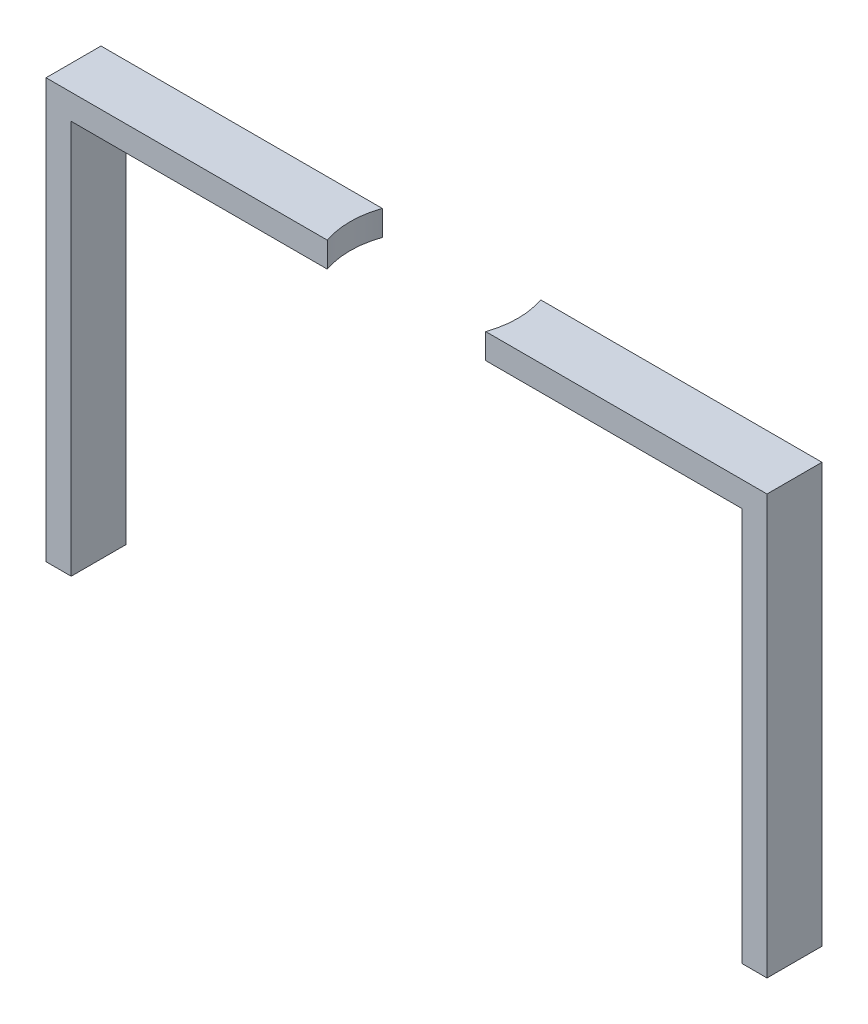
ISO-10303-21;
HEADER;
FILE_DESCRIPTION(('STEP AP214'),'2;1');
FILE_NAME('part.step','',(''),(''),'','','');
FILE_SCHEMA(('AUTOMOTIVE_DESIGN { 1 0 10303 214 1 1 1 1 }'));
ENDSEC;
DATA;
#1=APPLICATION_CONTEXT('core data for automotive mechanical design processes');
#2=APPLICATION_PROTOCOL_DEFINITION('international standard','automotive_design',2000,#1);
#3=PRODUCT_CONTEXT('',#1,'mechanical');
#4=PRODUCT('Part','Part','',(#3));
#5=PRODUCT_RELATED_PRODUCT_CATEGORY('part','',(#4));
#6=PRODUCT_DEFINITION_FORMATION('','',#4);
#7=PRODUCT_DEFINITION_CONTEXT('part definition',#1,'design');
#8=PRODUCT_DEFINITION('design','',#6,#7);
#9=PRODUCT_DEFINITION_SHAPE('','',#8);
#10=(LENGTH_UNIT() NAMED_UNIT(*) SI_UNIT(.MILLI.,.METRE.));
#11=(NAMED_UNIT(*) PLANE_ANGLE_UNIT() SI_UNIT($,.RADIAN.));
#12=(NAMED_UNIT(*) SI_UNIT($,.STERADIAN.) SOLID_ANGLE_UNIT());
#13=UNCERTAINTY_MEASURE_WITH_UNIT(LENGTH_MEASURE(1.E-05),#10,'distance_accuracy_value','');
#14=(GEOMETRIC_REPRESENTATION_CONTEXT(3) GLOBAL_UNCERTAINTY_ASSIGNED_CONTEXT((#13)) GLOBAL_UNIT_ASSIGNED_CONTEXT((#10,
#11,#12)) REPRESENTATION_CONTEXT('',''));
#15=CARTESIAN_POINT('',(0.,0.,0.));
#16=DIRECTION('',(0.,0.,1.));
#17=DIRECTION('',(1.,0.,0.));
#18=AXIS2_PLACEMENT_3D('',#15,#16,#17);
#19=CARTESIAN_POINT('',(-354.854368932039,121.072815533981,32.78));
#20=DIRECTION('',(0.,1.,0.));
#21=DIRECTION('',(0.,0.,1.));
#22=AXIS2_PLACEMENT_3D('',#19,#20,#21);
#23=PLANE('',#22);
#24=DIRECTION('',(1.,0.,0.));
#25=VECTOR('',#24,1.);
#26=CARTESIAN_POINT('',(-354.854368932039,121.072815533981,32.78));
#27=LINE('',#26,#25);
#28=CARTESIAN_POINT('',(-107.617011893356,121.072815533981,32.78));
#29=VERTEX_POINT('',#28);
#30=CARTESIAN_POINT('',(45.1456310679612,121.072815533981,32.78));
#31=VERTEX_POINT('',#30);
#32=EDGE_CURVE('E126',#29,#31,#27,.T.);
#33=ORIENTED_EDGE('',*,*,#32,.F.);
#34=CARTESIAN_POINT('',(-154.854368932039,121.072815533981,16.39));
#35=DIRECTION('',(0.,1.,0.));
#36=DIRECTION('',(-1.,0.,0.));
#37=AXIS2_PLACEMENT_3D('',#34,#35,#36);
#38=CIRCLE('',#37,50.);
#39=CARTESIAN_POINT('',(-107.617011893356,121.072815533981,0.));
#40=VERTEX_POINT('',#39);
#41=EDGE_CURVE('E66',#29,#40,#38,.T.);
#42=ORIENTED_EDGE('',*,*,#41,.T.);
#43=DIRECTION('',(1.,0.,0.));
#44=VECTOR('',#43,1.);
#45=CARTESIAN_POINT('',(-354.854368932039,121.072815533981,0.));
#46=LINE('',#45,#44);
#47=CARTESIAN_POINT('',(45.1456310679612,121.072815533981,0.));
#48=VERTEX_POINT('',#47);
#49=EDGE_CURVE('E130',#40,#48,#46,.T.);
#50=ORIENTED_EDGE('',*,*,#49,.T.);
#51=DIRECTION('',(0.,0.,-1.));
#52=VECTOR('',#51,1.);
#53=CARTESIAN_POINT('',(45.1456310679612,121.072815533981,32.78));
#54=LINE('',#53,#52);
#55=EDGE_CURVE('E150',#31,#48,#54,.T.);
#56=ORIENTED_EDGE('',*,*,#55,.F.);
#57=EDGE_LOOP('',(#33,#42,#50,#56));
#58=FACE_BOUND('',#57,.T.);
#59=ADVANCED_FACE('F49',(#58),#23,.F.);
#60=CARTESIAN_POINT('',(0.,0.,32.78));
#61=DIRECTION('',(0.,0.,1.));
#62=DIRECTION('',(1.,0.,0.));
#63=AXIS2_PLACEMENT_3D('',#60,#61,#62);
#64=PLANE('',#63);
#65=DIRECTION('',(0.,1.,0.));
#66=VECTOR('',#65,1.);
#67=CARTESIAN_POINT('',(-107.617011893356,121.072815533981,32.78));
#68=LINE('',#67,#66);
#69=CARTESIAN_POINT('',(-107.617011893356,136.072815533981,32.78));
#70=VERTEX_POINT('',#69);
#71=EDGE_CURVE('E59',#29,#70,#68,.T.);
#72=ORIENTED_EDGE('',*,*,#71,.F.);
#73=ORIENTED_EDGE('',*,*,#32,.T.);
#74=DIRECTION('',(0.,-1.,0.));
#75=VECTOR('',#74,1.);
#76=CARTESIAN_POINT('',(45.1456310679612,121.072815533981,32.78));
#77=LINE('',#76,#75);
#78=CARTESIAN_POINT('',(45.1456310679612,-113.927184466019,32.78));
#79=VERTEX_POINT('',#78);
#80=EDGE_CURVE('E129',#31,#79,#77,.T.);
#81=ORIENTED_EDGE('',*,*,#80,.T.);
#82=DIRECTION('',(1.,0.,0.));
#83=VECTOR('',#82,1.);
#84=CARTESIAN_POINT('',(45.1456310679612,-113.927184466019,32.78));
#85=LINE('',#84,#83);
#86=CARTESIAN_POINT('',(60.1456310679612,-113.927184466019,32.78));
#87=VERTEX_POINT('',#86);
#88=EDGE_CURVE('E122',#79,#87,#85,.T.);
#89=ORIENTED_EDGE('',*,*,#88,.T.);
#90=DIRECTION('',(0.,1.,0.));
#91=VECTOR('',#90,1.);
#92=CARTESIAN_POINT('',(60.1456310679612,-113.927184466019,32.78));
#93=LINE('',#92,#91);
#94=CARTESIAN_POINT('',(60.1456310679612,136.072815533981,32.78));
#95=VERTEX_POINT('',#94);
#96=EDGE_CURVE('E113',#87,#95,#93,.T.);
#97=ORIENTED_EDGE('',*,*,#96,.T.);
#98=DIRECTION('',(-1.,0.,0.));
#99=VECTOR('',#98,1.);
#100=CARTESIAN_POINT('',(60.1456310679612,136.072815533981,32.78));
#101=LINE('',#100,#99);
#102=EDGE_CURVE('E108',#95,#70,#101,.T.);
#103=ORIENTED_EDGE('',*,*,#102,.T.);
#104=EDGE_LOOP('',(#72,#73,#81,#89,#97,#103));
#105=FACE_BOUND('',#104,.T.);
#106=ADVANCED_FACE('F111',(#105),#64,.T.);
#107=CARTESIAN_POINT('',(0.,0.,0.));
#108=DIRECTION('',(0.,0.,1.));
#109=DIRECTION('',(1.,0.,0.));
#110=AXIS2_PLACEMENT_3D('',#107,#108,#109);
#111=PLANE('',#110);
#112=ORIENTED_EDGE('',*,*,#49,.F.);
#113=DIRECTION('',(0.,1.,0.));
#114=VECTOR('',#113,1.);
#115=CARTESIAN_POINT('',(-107.617011893356,121.072815533981,0.));
#116=LINE('',#115,#114);
#117=CARTESIAN_POINT('',(-107.617011893356,136.072815533981,0.));
#118=VERTEX_POINT('',#117);
#119=EDGE_CURVE('E116',#40,#118,#116,.T.);
#120=ORIENTED_EDGE('',*,*,#119,.T.);
#121=DIRECTION('',(-1.,0.,0.));
#122=VECTOR('',#121,1.);
#123=CARTESIAN_POINT('',(60.1456310679612,136.072815533981,0.));
#124=LINE('',#123,#122);
#125=CARTESIAN_POINT('',(60.1456310679612,136.072815533981,0.));
#126=VERTEX_POINT('',#125);
#127=EDGE_CURVE('E110',#126,#118,#124,.T.);
#128=ORIENTED_EDGE('',*,*,#127,.F.);
#129=DIRECTION('',(0.,1.,0.));
#130=VECTOR('',#129,1.);
#131=CARTESIAN_POINT('',(60.1456310679612,-113.927184466019,0.));
#132=LINE('',#131,#130);
#133=CARTESIAN_POINT('',(60.1456310679612,-113.927184466019,0.));
#134=VERTEX_POINT('',#133);
#135=EDGE_CURVE('E166',#134,#126,#132,.T.);
#136=ORIENTED_EDGE('',*,*,#135,.F.);
#137=DIRECTION('',(1.,0.,0.));
#138=VECTOR('',#137,1.);
#139=CARTESIAN_POINT('',(45.1456310679612,-113.927184466019,0.));
#140=LINE('',#139,#138);
#141=CARTESIAN_POINT('',(45.1456310679612,-113.927184466019,0.));
#142=VERTEX_POINT('',#141);
#143=EDGE_CURVE('E145',#142,#134,#140,.T.);
#144=ORIENTED_EDGE('',*,*,#143,.F.);
#145=DIRECTION('',(0.,-1.,0.));
#146=VECTOR('',#145,1.);
#147=CARTESIAN_POINT('',(45.1456310679612,121.072815533981,0.));
#148=LINE('',#147,#146);
#149=EDGE_CURVE('E120',#48,#142,#148,.T.);
#150=ORIENTED_EDGE('',*,*,#149,.F.);
#151=EDGE_LOOP('',(#112,#120,#128,#136,#144,#150));
#152=FACE_BOUND('',#151,.T.);
#153=ADVANCED_FACE('F142',(#152),#111,.F.);
#154=CARTESIAN_POINT('',(45.1456310679612,121.072815533981,32.78));
#155=DIRECTION('',(1.,0.,0.));
#156=DIRECTION('',(0.,1.,0.));
#157=AXIS2_PLACEMENT_3D('',#154,#155,#156);
#158=PLANE('',#157);
#159=ORIENTED_EDGE('',*,*,#149,.T.);
#160=DIRECTION('',(0.,0.,-1.));
#161=VECTOR('',#160,1.);
#162=CARTESIAN_POINT('',(45.1456310679612,-113.927184466019,32.78));
#163=LINE('',#162,#161);
#164=EDGE_CURVE('E162',#79,#142,#163,.T.);
#165=ORIENTED_EDGE('',*,*,#164,.F.);
#166=ORIENTED_EDGE('',*,*,#80,.F.);
#167=ORIENTED_EDGE('',*,*,#55,.T.);
#168=EDGE_LOOP('',(#159,#165,#166,#167));
#169=FACE_BOUND('',#168,.T.);
#170=ADVANCED_FACE('F163',(#169),#158,.F.);
#171=CARTESIAN_POINT('',(45.1456310679612,-113.927184466019,32.78));
#172=DIRECTION('',(0.,1.,0.));
#173=DIRECTION('',(0.,0.,1.));
#174=AXIS2_PLACEMENT_3D('',#171,#172,#173);
#175=PLANE('',#174);
#176=ORIENTED_EDGE('',*,*,#143,.T.);
#177=DIRECTION('',(0.,0.,-1.));
#178=VECTOR('',#177,1.);
#179=CARTESIAN_POINT('',(60.1456310679612,-113.927184466019,32.78));
#180=LINE('',#179,#178);
#181=EDGE_CURVE('E133',#87,#134,#180,.T.);
#182=ORIENTED_EDGE('',*,*,#181,.F.);
#183=ORIENTED_EDGE('',*,*,#88,.F.);
#184=ORIENTED_EDGE('',*,*,#164,.T.);
#185=EDGE_LOOP('',(#176,#182,#183,#184));
#186=FACE_BOUND('',#185,.T.);
#187=ADVANCED_FACE('F168',(#186),#175,.F.);
#188=CARTESIAN_POINT('',(60.1456310679612,-113.927184466019,32.78));
#189=DIRECTION('',(-1.,0.,0.));
#190=DIRECTION('',(0.,-1.,0.));
#191=AXIS2_PLACEMENT_3D('',#188,#189,#190);
#192=PLANE('',#191);
#193=ORIENTED_EDGE('',*,*,#135,.T.);
#194=DIRECTION('',(0.,0.,-1.));
#195=VECTOR('',#194,1.);
#196=CARTESIAN_POINT('',(60.1456310679612,136.072815533981,32.78));
#197=LINE('',#196,#195);
#198=EDGE_CURVE('E101',#95,#126,#197,.T.);
#199=ORIENTED_EDGE('',*,*,#198,.F.);
#200=ORIENTED_EDGE('',*,*,#96,.F.);
#201=ORIENTED_EDGE('',*,*,#181,.T.);
#202=EDGE_LOOP('',(#193,#199,#200,#201));
#203=FACE_BOUND('',#202,.T.);
#204=ADVANCED_FACE('F173',(#203),#192,.F.);
#205=CARTESIAN_POINT('',(60.1456310679612,136.072815533981,32.78));
#206=DIRECTION('',(0.,-1.,0.));
#207=DIRECTION('',(1.,0.,0.));
#208=AXIS2_PLACEMENT_3D('',#205,#206,#207);
#209=PLANE('',#208);
#210=ORIENTED_EDGE('',*,*,#127,.T.);
#211=CARTESIAN_POINT('',(-154.854368932039,136.072815533981,16.39));
#212=DIRECTION('',(0.,1.,0.));
#213=DIRECTION('',(-1.,0.,0.));
#214=AXIS2_PLACEMENT_3D('',#211,#212,#213);
#215=CIRCLE('',#214,50.);
#216=EDGE_CURVE('E12',#70,#118,#215,.T.);
#217=ORIENTED_EDGE('',*,*,#216,.F.);
#218=ORIENTED_EDGE('',*,*,#102,.F.);
#219=ORIENTED_EDGE('',*,*,#198,.T.);
#220=EDGE_LOOP('',(#210,#217,#218,#219));
#221=FACE_BOUND('',#220,.T.);
#222=ADVANCED_FACE('F106',(#221),#209,.F.);
#223=CARTESIAN_POINT('',(-154.854368932039,121.072815533981,16.39));
#224=DIRECTION('',(0.,1.,0.));
#225=DIRECTION('',(-1.,0.,0.));
#226=AXIS2_PLACEMENT_3D('',#223,#224,#225);
#227=CYLINDRICAL_SURFACE('',#226,50.);
#228=ORIENTED_EDGE('',*,*,#71,.T.);
#229=ORIENTED_EDGE('',*,*,#216,.T.);
#230=ORIENTED_EDGE('',*,*,#119,.F.);
#231=ORIENTED_EDGE('',*,*,#41,.F.);
#232=EDGE_LOOP('',(#228,#229,#230,#231));
#233=FACE_BOUND('',#232,.T.);
#234=ADVANCED_FACE('F51',(#233),#227,.F.);
#235=CLOSED_SHELL('',(#59,#106,#153,#170,#187,#204,#222,#234));
#236=MANIFOLD_SOLID_BREP('B2',#235);
#237=CARTESIAN_POINT('',(-369.854368932039,136.072815533981,32.78));
#238=DIRECTION('',(1.,0.,0.));
#239=DIRECTION('',(0.,1.,0.));
#240=AXIS2_PLACEMENT_3D('',#237,#238,#239);
#241=PLANE('',#240);
#242=DIRECTION('',(0.,-1.,0.));
#243=VECTOR('',#242,1.);
#244=CARTESIAN_POINT('',(-369.854368932039,136.072815533981,0.));
#245=LINE('',#244,#243);
#246=CARTESIAN_POINT('',(-369.854368932039,136.072815533981,0.));
#247=VERTEX_POINT('',#246);
#248=CARTESIAN_POINT('',(-369.854368932039,-113.927184466019,0.));
#249=VERTEX_POINT('',#248);
#250=EDGE_CURVE('E310',#247,#249,#245,.T.);
#251=ORIENTED_EDGE('',*,*,#250,.T.);
#252=DIRECTION('',(0.,0.,-1.));
#253=VECTOR('',#252,1.);
#254=CARTESIAN_POINT('',(-369.854368932039,-113.927184466019,32.78));
#255=LINE('',#254,#253);
#256=CARTESIAN_POINT('',(-369.854368932039,-113.927184466019,32.78));
#257=VERTEX_POINT('',#256);
#258=EDGE_CURVE('E250',#257,#249,#255,.T.);
#259=ORIENTED_EDGE('',*,*,#258,.F.);
#260=DIRECTION('',(0.,-1.,0.));
#261=VECTOR('',#260,1.);
#262=CARTESIAN_POINT('',(-369.854368932039,136.072815533981,32.78));
#263=LINE('',#262,#261);
#264=CARTESIAN_POINT('',(-369.854368932039,136.072815533981,32.78));
#265=VERTEX_POINT('',#264);
#266=EDGE_CURVE('E331',#265,#257,#263,.T.);
#267=ORIENTED_EDGE('',*,*,#266,.F.);
#268=DIRECTION('',(0.,0.,-1.));
#269=VECTOR('',#268,1.);
#270=CARTESIAN_POINT('',(-369.854368932039,136.072815533981,32.78));
#271=LINE('',#270,#269);
#272=EDGE_CURVE('E313',#265,#247,#271,.T.);
#273=ORIENTED_EDGE('',*,*,#272,.T.);
#274=EDGE_LOOP('',(#251,#259,#267,#273));
#275=FACE_BOUND('',#274,.T.);
#276=ADVANCED_FACE('F243',(#275),#241,.F.);
#277=CARTESIAN_POINT('',(-369.854368932039,-113.927184466019,32.78));
#278=DIRECTION('',(0.,1.,0.));
#279=DIRECTION('',(0.,0.,1.));
#280=AXIS2_PLACEMENT_3D('',#277,#278,#279);
#281=PLANE('',#280);
#282=DIRECTION('',(1.,0.,0.));
#283=VECTOR('',#282,1.);
#284=CARTESIAN_POINT('',(-369.854368932039,-113.927184466019,0.));
#285=LINE('',#284,#283);
#286=CARTESIAN_POINT('',(-354.854368932039,-113.927184466019,0.));
#287=VERTEX_POINT('',#286);
#288=EDGE_CURVE('E324',#249,#287,#285,.T.);
#289=ORIENTED_EDGE('',*,*,#288,.T.);
#290=DIRECTION('',(0.,0.,-1.));
#291=VECTOR('',#290,1.);
#292=CARTESIAN_POINT('',(-354.854368932039,-113.927184466019,32.78));
#293=LINE('',#292,#291);
#294=CARTESIAN_POINT('',(-354.854368932039,-113.927184466019,32.78));
#295=VERTEX_POINT('',#294);
#296=EDGE_CURVE('E335',#295,#287,#293,.T.);
#297=ORIENTED_EDGE('',*,*,#296,.F.);
#298=DIRECTION('',(1.,0.,0.));
#299=VECTOR('',#298,1.);
#300=CARTESIAN_POINT('',(-369.854368932039,-113.927184466019,32.78));
#301=LINE('',#300,#299);
#302=EDGE_CURVE('E295',#257,#295,#301,.T.);
#303=ORIENTED_EDGE('',*,*,#302,.F.);
#304=ORIENTED_EDGE('',*,*,#258,.T.);
#305=EDGE_LOOP('',(#289,#297,#303,#304));
#306=FACE_BOUND('',#305,.T.);
#307=ADVANCED_FACE('F338',(#306),#281,.F.);
#308=CARTESIAN_POINT('',(-354.854368932039,-113.927184466019,32.78));
#309=DIRECTION('',(-1.,0.,0.));
#310=DIRECTION('',(0.,0.,1.));
#311=AXIS2_PLACEMENT_3D('',#308,#309,#310);
#312=PLANE('',#311);
#313=DIRECTION('',(0.,1.,0.));
#314=VECTOR('',#313,1.);
#315=CARTESIAN_POINT('',(-354.854368932039,-113.927184466019,0.));
#316=LINE('',#315,#314);
#317=CARTESIAN_POINT('',(-354.854368932039,121.072815533981,0.));
#318=VERTEX_POINT('',#317);
#319=EDGE_CURVE('E326',#287,#318,#316,.T.);
#320=ORIENTED_EDGE('',*,*,#319,.T.);
#321=DIRECTION('',(0.,0.,-1.));
#322=VECTOR('',#321,1.);
#323=CARTESIAN_POINT('',(-354.854368932039,121.072815533981,32.78));
#324=LINE('',#323,#322);
#325=CARTESIAN_POINT('',(-354.854368932039,121.072815533981,32.78));
#326=VERTEX_POINT('',#325);
#327=EDGE_CURVE('E316',#326,#318,#324,.T.);
#328=ORIENTED_EDGE('',*,*,#327,.F.);
#329=DIRECTION('',(0.,1.,0.));
#330=VECTOR('',#329,1.);
#331=CARTESIAN_POINT('',(-354.854368932039,-113.927184466019,32.78));
#332=LINE('',#331,#330);
#333=EDGE_CURVE('E318',#295,#326,#332,.T.);
#334=ORIENTED_EDGE('',*,*,#333,.F.);
#335=ORIENTED_EDGE('',*,*,#296,.T.);
#336=EDGE_LOOP('',(#320,#328,#334,#335));
#337=FACE_BOUND('',#336,.T.);
#338=ADVANCED_FACE('F347',(#337),#312,.F.);
#339=CARTESIAN_POINT('',(0.,0.,0.));
#340=DIRECTION('',(0.,0.,1.));
#341=DIRECTION('',(1.,0.,0.));
#342=AXIS2_PLACEMENT_3D('',#339,#340,#341);
#343=PLANE('',#342);
#344=DIRECTION('',(-1.,0.,0.));
#345=VECTOR('',#344,1.);
#346=CARTESIAN_POINT('',(60.1456310679612,136.072815533981,0.));
#347=LINE('',#346,#345);
#348=CARTESIAN_POINT('',(-202.091725970722,136.072815533981,0.));
#349=VERTEX_POINT('',#348);
#350=EDGE_CURVE('E287',#349,#247,#347,.T.);
#351=ORIENTED_EDGE('',*,*,#350,.F.);
#352=DIRECTION('',(0.,1.,0.));
#353=VECTOR('',#352,1.);
#354=CARTESIAN_POINT('',(-202.091725970722,121.072815533981,0.));
#355=LINE('',#354,#353);
#356=CARTESIAN_POINT('',(-202.091725970722,121.072815533981,0.));
#357=VERTEX_POINT('',#356);
#358=EDGE_CURVE('E47',#349,#357,#355,.F.);
#359=ORIENTED_EDGE('',*,*,#358,.T.);
#360=DIRECTION('',(1.,0.,0.));
#361=VECTOR('',#360,1.);
#362=CARTESIAN_POINT('',(-354.854368932039,121.072815533981,0.));
#363=LINE('',#362,#361);
#364=EDGE_CURVE('E328',#318,#357,#363,.T.);
#365=ORIENTED_EDGE('',*,*,#364,.F.);
#366=ORIENTED_EDGE('',*,*,#319,.F.);
#367=ORIENTED_EDGE('',*,*,#288,.F.);
#368=ORIENTED_EDGE('',*,*,#250,.F.);
#369=EDGE_LOOP('',(#351,#359,#365,#366,#367,#368));
#370=FACE_BOUND('',#369,.T.);
#371=ADVANCED_FACE('F342',(#370),#343,.F.);
#372=CARTESIAN_POINT('',(0.,0.,32.78));
#373=DIRECTION('',(0.,0.,1.));
#374=DIRECTION('',(1.,0.,0.));
#375=AXIS2_PLACEMENT_3D('',#372,#373,#374);
#376=PLANE('',#375);
#377=DIRECTION('',(0.,1.,0.));
#378=VECTOR('',#377,1.);
#379=CARTESIAN_POINT('',(-202.091725970722,121.072815533981,32.78));
#380=LINE('',#379,#378);
#381=CARTESIAN_POINT('',(-202.091725970722,136.072815533981,32.78));
#382=VERTEX_POINT('',#381);
#383=CARTESIAN_POINT('',(-202.091725970722,121.072815533981,32.78));
#384=VERTEX_POINT('',#383);
#385=EDGE_CURVE('E304',#382,#384,#380,.F.);
#386=ORIENTED_EDGE('',*,*,#385,.F.);
#387=DIRECTION('',(-1.,0.,0.));
#388=VECTOR('',#387,1.);
#389=CARTESIAN_POINT('',(60.1456310679612,136.072815533981,32.78));
#390=LINE('',#389,#388);
#391=EDGE_CURVE('E265',#382,#265,#390,.T.);
#392=ORIENTED_EDGE('',*,*,#391,.T.);
#393=ORIENTED_EDGE('',*,*,#266,.T.);
#394=ORIENTED_EDGE('',*,*,#302,.T.);
#395=ORIENTED_EDGE('',*,*,#333,.T.);
#396=DIRECTION('',(1.,0.,0.));
#397=VECTOR('',#396,1.);
#398=CARTESIAN_POINT('',(-354.854368932039,121.072815533981,32.78));
#399=LINE('',#398,#397);
#400=EDGE_CURVE('E309',#326,#384,#399,.T.);
#401=ORIENTED_EDGE('',*,*,#400,.T.);
#402=EDGE_LOOP('',(#386,#392,#393,#394,#395,#401));
#403=FACE_BOUND('',#402,.T.);
#404=ADVANCED_FACE('F307',(#403),#376,.T.);
#405=CARTESIAN_POINT('',(60.1456310679612,136.072815533981,32.78));
#406=DIRECTION('',(0.,-1.,0.));
#407=DIRECTION('',(1.,0.,0.));
#408=AXIS2_PLACEMENT_3D('',#405,#406,#407);
#409=PLANE('',#408);
#410=ORIENTED_EDGE('',*,*,#391,.F.);
#411=CARTESIAN_POINT('',(-154.854368932039,136.072815533981,16.39));
#412=DIRECTION('',(0.,1.,0.));
#413=DIRECTION('',(-1.,0.,0.));
#414=AXIS2_PLACEMENT_3D('',#411,#412,#413);
#415=CIRCLE('',#414,50.);
#416=EDGE_CURVE('E302',#349,#382,#415,.T.);
#417=ORIENTED_EDGE('',*,*,#416,.F.);
#418=ORIENTED_EDGE('',*,*,#350,.T.);
#419=ORIENTED_EDGE('',*,*,#272,.F.);
#420=EDGE_LOOP('',(#410,#417,#418,#419));
#421=FACE_BOUND('',#420,.T.);
#422=ADVANCED_FACE('F312',(#421),#409,.F.);
#423=CARTESIAN_POINT('',(-354.854368932039,121.072815533981,32.78));
#424=DIRECTION('',(0.,1.,0.));
#425=DIRECTION('',(0.,0.,1.));
#426=AXIS2_PLACEMENT_3D('',#423,#424,#425);
#427=PLANE('',#426);
#428=ORIENTED_EDGE('',*,*,#364,.T.);
#429=CARTESIAN_POINT('',(-154.854368932039,121.072815533981,16.39));
#430=DIRECTION('',(0.,1.,0.));
#431=DIRECTION('',(-1.,0.,0.));
#432=AXIS2_PLACEMENT_3D('',#429,#430,#431);
#433=CIRCLE('',#432,50.);
#434=EDGE_CURVE('E257',#357,#384,#433,.T.);
#435=ORIENTED_EDGE('',*,*,#434,.T.);
#436=ORIENTED_EDGE('',*,*,#400,.F.);
#437=ORIENTED_EDGE('',*,*,#327,.T.);
#438=EDGE_LOOP('',(#428,#435,#436,#437));
#439=FACE_BOUND('',#438,.T.);
#440=ADVANCED_FACE('F350',(#439),#427,.F.);
#441=CARTESIAN_POINT('',(-154.854368932039,121.072815533981,16.39));
#442=DIRECTION('',(0.,1.,0.));
#443=DIRECTION('',(-1.,0.,0.));
#444=AXIS2_PLACEMENT_3D('',#441,#442,#443);
#445=CYLINDRICAL_SURFACE('',#444,50.);
#446=ORIENTED_EDGE('',*,*,#385,.T.);
#447=ORIENTED_EDGE('',*,*,#434,.F.);
#448=ORIENTED_EDGE('',*,*,#358,.F.);
#449=ORIENTED_EDGE('',*,*,#416,.T.);
#450=EDGE_LOOP('',(#446,#447,#448,#449));
#451=FACE_BOUND('',#450,.T.);
#452=ADVANCED_FACE('F303',(#451),#445,.F.);
#453=CLOSED_SHELL('',(#276,#307,#338,#371,#404,#422,#440,#452));
#454=MANIFOLD_SOLID_BREP('B6',#453);
#455=ADVANCED_BREP_SHAPE_REPRESENTATION('',(#18,#236,#454),#14);
#456=SHAPE_DEFINITION_REPRESENTATION(#9,#455);
ENDSEC;
END-ISO-10303-21;
